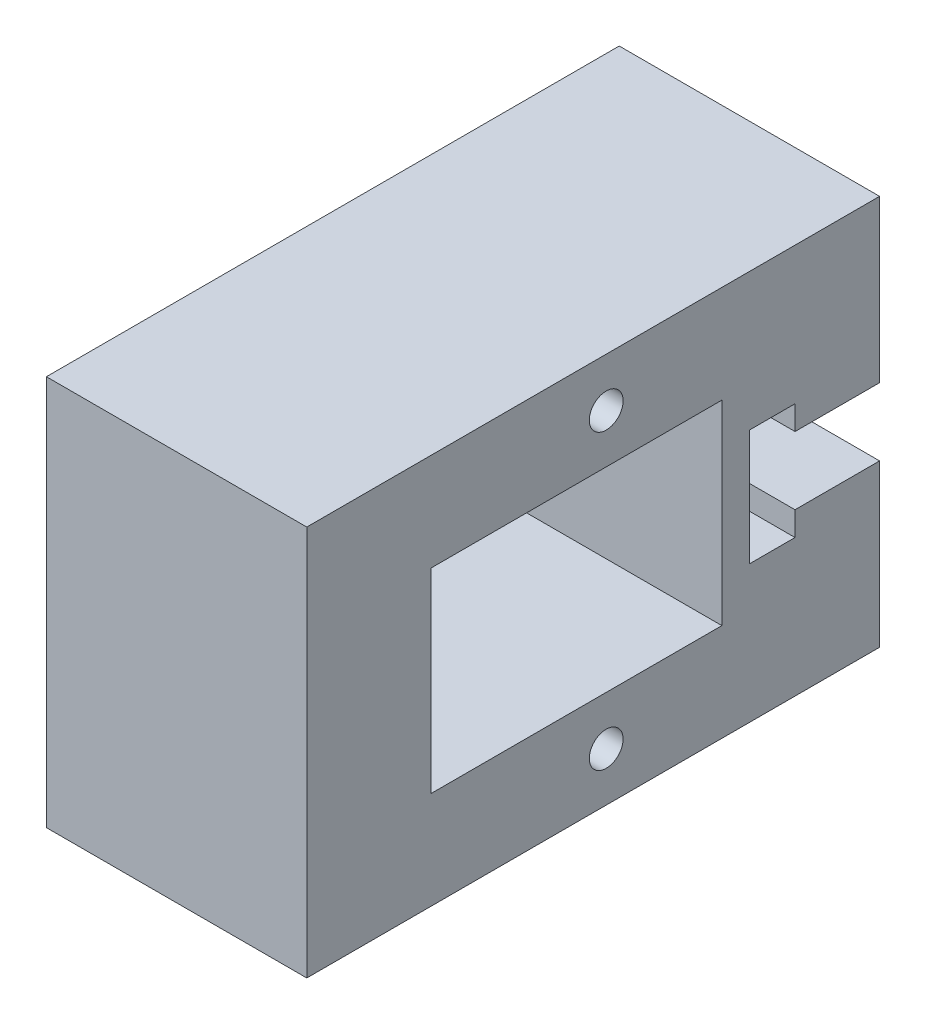
ISO-10303-21;
HEADER;
FILE_DESCRIPTION(('STEP AP214'),'2;1');
FILE_NAME('part.step','',(''),(''),'','','');
FILE_SCHEMA(('AUTOMOTIVE_DESIGN { 1 0 10303 214 1 1 1 1 }'));
ENDSEC;
DATA;
#1=APPLICATION_CONTEXT('core data for automotive mechanical design processes');
#2=APPLICATION_PROTOCOL_DEFINITION('international standard','automotive_design',2000,#1);
#3=PRODUCT_CONTEXT('',#1,'mechanical');
#4=PRODUCT('Part','Part','',(#3));
#5=PRODUCT_RELATED_PRODUCT_CATEGORY('part','',(#4));
#6=PRODUCT_DEFINITION_FORMATION('','',#4);
#7=PRODUCT_DEFINITION_CONTEXT('part definition',#1,'design');
#8=PRODUCT_DEFINITION('design','',#6,#7);
#9=PRODUCT_DEFINITION_SHAPE('','',#8);
#10=(LENGTH_UNIT() NAMED_UNIT(*) SI_UNIT(.MILLI.,.METRE.));
#11=(NAMED_UNIT(*) PLANE_ANGLE_UNIT() SI_UNIT($,.RADIAN.));
#12=(NAMED_UNIT(*) SI_UNIT($,.STERADIAN.) SOLID_ANGLE_UNIT());
#13=UNCERTAINTY_MEASURE_WITH_UNIT(LENGTH_MEASURE(1.E-05),#10,'distance_accuracy_value','');
#14=(GEOMETRIC_REPRESENTATION_CONTEXT(3) GLOBAL_UNCERTAINTY_ASSIGNED_CONTEXT((#13)) GLOBAL_UNIT_ASSIGNED_CONTEXT((#10,
#11,#12)) REPRESENTATION_CONTEXT('',''));
#15=CARTESIAN_POINT('',(0.,0.,0.));
#16=DIRECTION('',(0.,0.,1.));
#17=DIRECTION('',(1.,0.,0.));
#18=AXIS2_PLACEMENT_3D('',#15,#16,#17);
#19=CARTESIAN_POINT('',(3.81,3.175,43.7803718369585));
#20=DIRECTION('',(0.,0.,1.));
#21=DIRECTION('',(1.,0.,0.));
#22=AXIS2_PLACEMENT_3D('',#19,#20,#21);
#23=PLANE('',#22);
#24=DIRECTION('',(-1.,0.,0.));
#25=VECTOR('',#24,1.);
#26=CARTESIAN_POINT('',(25.4,28.575,43.7803718369585));
#27=LINE('',#26,#25);
#28=CARTESIAN_POINT('',(25.4,28.575,43.7803718369585));
#29=VERTEX_POINT('',#28);
#30=CARTESIAN_POINT('',(3.81,28.575,43.7803718369585));
#31=VERTEX_POINT('',#30);
#32=EDGE_CURVE('E199',#29,#31,#27,.T.);
#33=ORIENTED_EDGE('',*,*,#32,.F.);
#34=DIRECTION('',(0.,-1.,0.));
#35=VECTOR('',#34,1.);
#36=CARTESIAN_POINT('',(25.4,3.175,43.7803718369585));
#37=LINE('',#36,#35);
#38=CARTESIAN_POINT('',(25.4,9.525,43.7803718369585));
#39=VERTEX_POINT('',#38);
#40=EDGE_CURVE('E317',#29,#39,#37,.T.);
#41=ORIENTED_EDGE('',*,*,#40,.T.);
#42=DIRECTION('',(-1.,0.,0.));
#43=VECTOR('',#42,1.);
#44=CARTESIAN_POINT('',(25.4,9.525,43.7803718369585));
#45=LINE('',#44,#43);
#46=CARTESIAN_POINT('',(3.81,9.525,43.7803718369585));
#47=VERTEX_POINT('',#46);
#48=EDGE_CURVE('E353',#39,#47,#45,.T.);
#49=ORIENTED_EDGE('',*,*,#48,.T.);
#50=DIRECTION('',(0.,-1.,0.));
#51=VECTOR('',#50,1.);
#52=CARTESIAN_POINT('',(3.81,3.175,43.7803718369585));
#53=LINE('',#52,#51);
#54=EDGE_CURVE('E200',#31,#47,#53,.T.);
#55=ORIENTED_EDGE('',*,*,#54,.F.);
#56=EDGE_LOOP('',(#33,#41,#49,#55));
#57=FACE_BOUND('',#56,.T.);
#58=ADVANCED_FACE('F39',(#57),#23,.F.);
#59=CARTESIAN_POINT('',(3.81,3.175,15.3860528668309));
#60=DIRECTION('',(0.,0.,-1.));
#61=DIRECTION('',(-1.,0.,0.));
#62=AXIS2_PLACEMENT_3D('',#59,#60,#61);
#63=PLANE('',#62);
#64=DIRECTION('',(0.,1.,0.));
#65=VECTOR('',#64,1.);
#66=CARTESIAN_POINT('',(0.,8.255,15.3860528668309));
#67=LINE('',#66,#65);
#68=CARTESIAN_POINT('',(0.,9.525,15.3860528668309));
#69=VERTEX_POINT('',#68);
#70=CARTESIAN_POINT('',(0.,28.575,15.3860528668309));
#71=VERTEX_POINT('',#70);
#72=EDGE_CURVE('E350',#69,#71,#67,.T.);
#73=ORIENTED_EDGE('',*,*,#72,.F.);
#74=DIRECTION('',(-1.,0.,0.));
#75=VECTOR('',#74,1.);
#76=CARTESIAN_POINT('',(25.4,9.525,15.3860528668309));
#77=LINE('',#76,#75);
#78=CARTESIAN_POINT('',(25.4,9.525,15.3860528668309));
#79=VERTEX_POINT('',#78);
#80=EDGE_CURVE('E64',#79,#69,#77,.T.);
#81=ORIENTED_EDGE('',*,*,#80,.F.);
#82=DIRECTION('',(0.,1.,0.));
#83=VECTOR('',#82,1.);
#84=CARTESIAN_POINT('',(25.4,3.175,15.3860528668309));
#85=LINE('',#84,#83);
#86=CARTESIAN_POINT('',(25.4,28.575,15.3860528668309));
#87=VERTEX_POINT('',#86);
#88=EDGE_CURVE('E313',#79,#87,#85,.T.);
#89=ORIENTED_EDGE('',*,*,#88,.T.);
#90=DIRECTION('',(-1.,0.,0.));
#91=VECTOR('',#90,1.);
#92=CARTESIAN_POINT('',(25.4,28.575,15.3860528668309));
#93=LINE('',#92,#91);
#94=EDGE_CURVE('E53',#87,#71,#93,.T.);
#95=ORIENTED_EDGE('',*,*,#94,.T.);
#96=EDGE_LOOP('',(#73,#81,#89,#95));
#97=FACE_BOUND('',#96,.T.);
#98=ADVANCED_FACE('F375',(#97),#63,.F.);
#99=CARTESIAN_POINT('',(3.81,0.,0.));
#100=DIRECTION('',(1.,0.,0.));
#101=DIRECTION('',(0.,0.,-1.));
#102=AXIS2_PLACEMENT_3D('',#99,#100,#101);
#103=PLANE('',#102);
#104=CARTESIAN_POINT('',(3.81,20.0659999999997,37.8193000873051));
#105=DIRECTION('',(1.,0.,0.));
#106=DIRECTION('',(0.,0.,-1.));
#107=AXIS2_PLACEMENT_3D('',#104,#105,#106);
#108=CIRCLE('',#107,3.175);
#109=CARTESIAN_POINT('',(3.81,20.0659999999997,34.6443000873051));
#110=VERTEX_POINT('',#109);
#111=EDGE_CURVE('E311',#110,#110,#108,.F.);
#112=ORIENTED_EDGE('',*,*,#111,.T.);
#113=EDGE_LOOP('',(#112));
#114=FACE_BOUND('',#113,.T.);
#115=DIRECTION('',(0.,-1.,0.));
#116=VECTOR('',#115,1.);
#117=CARTESIAN_POINT('',(3.81,0.,28.5750000000002));
#118=LINE('',#117,#116);
#119=CARTESIAN_POINT('',(3.81,28.575,28.5750000000002));
#120=VERTEX_POINT('',#119);
#121=CARTESIAN_POINT('',(3.81,9.525,28.5750000000002));
#122=VERTEX_POINT('',#121);
#123=EDGE_CURVE('E185',#120,#122,#118,.T.);
#124=ORIENTED_EDGE('',*,*,#123,.F.);
#125=DIRECTION('',(0.,0.,1.));
#126=VECTOR('',#125,1.);
#127=CARTESIAN_POINT('',(3.81,28.575,0.));
#128=LINE('',#127,#126);
#129=EDGE_CURVE('E197',#120,#31,#128,.T.);
#130=ORIENTED_EDGE('',*,*,#129,.T.);
#131=ORIENTED_EDGE('',*,*,#54,.T.);
#132=DIRECTION('',(0.,0.,-1.));
#133=VECTOR('',#132,1.);
#134=CARTESIAN_POINT('',(3.81,9.525,0.));
#135=LINE('',#134,#133);
#136=EDGE_CURVE('E195',#47,#122,#135,.T.);
#137=ORIENTED_EDGE('',*,*,#136,.T.);
#138=EDGE_LOOP('',(#124,#130,#131,#137));
#139=FACE_BOUND('',#138,.T.);
#140=ADVANCED_FACE('F191',(#114,#139),#103,.T.);
#141=CARTESIAN_POINT('',(25.4,19.05,28.5750000000002));
#142=DIRECTION('',(0.,0.,1.));
#143=DIRECTION('',(1.,0.,0.));
#144=AXIS2_PLACEMENT_3D('',#141,#142,#143);
#145=PLANE('',#144);
#146=DIRECTION('',(-1.,0.,0.));
#147=VECTOR('',#146,1.);
#148=CARTESIAN_POINT('',(25.4,28.575,28.5750000000002));
#149=LINE('',#148,#147);
#150=CARTESIAN_POINT('',(0.,28.575,28.5750000000002));
#151=VERTEX_POINT('',#150);
#152=EDGE_CURVE('E11',#120,#151,#149,.T.);
#153=ORIENTED_EDGE('',*,*,#152,.F.);
#154=ORIENTED_EDGE('',*,*,#123,.T.);
#155=DIRECTION('',(1.,0.,0.));
#156=VECTOR('',#155,1.);
#157=CARTESIAN_POINT('',(25.4,9.525,28.5750000000002));
#158=LINE('',#157,#156);
#159=CARTESIAN_POINT('',(0.,9.525,28.5750000000002));
#160=VERTEX_POINT('',#159);
#161=EDGE_CURVE('E50',#160,#122,#158,.T.);
#162=ORIENTED_EDGE('',*,*,#161,.F.);
#163=DIRECTION('',(0.,1.,0.));
#164=VECTOR('',#163,1.);
#165=CARTESIAN_POINT('',(0.,19.05,28.5750000000002));
#166=LINE('',#165,#164);
#167=EDGE_CURVE('E275',#160,#151,#166,.T.);
#168=ORIENTED_EDGE('',*,*,#167,.T.);
#169=EDGE_LOOP('',(#153,#154,#162,#168));
#170=FACE_BOUND('',#169,.T.);
#171=ADVANCED_FACE('F183',(#170),#145,.F.);
#172=CARTESIAN_POINT('',(0.,0.,0.));
#173=DIRECTION('',(-1.,0.,0.));
#174=DIRECTION('',(0.,0.,1.));
#175=AXIS2_PLACEMENT_3D('',#172,#173,#174);
#176=PLANE('',#175);
#177=DIRECTION('',(0.,0.,1.));
#178=VECTOR('',#177,1.);
#179=CARTESIAN_POINT('',(0.,9.525,43.7803718369585));
#180=LINE('',#179,#178);
#181=EDGE_CURVE('E202',#69,#160,#180,.T.);
#182=ORIENTED_EDGE('',*,*,#181,.F.);
#183=ORIENTED_EDGE('',*,*,#72,.T.);
#184=DIRECTION('',(0.,0.,-1.));
#185=VECTOR('',#184,1.);
#186=CARTESIAN_POINT('',(0.,28.575,43.7803718369585));
#187=LINE('',#186,#185);
#188=EDGE_CURVE('E352',#151,#71,#187,.T.);
#189=ORIENTED_EDGE('',*,*,#188,.F.);
#190=ORIENTED_EDGE('',*,*,#167,.F.);
#191=EDGE_LOOP('',(#182,#183,#189,#190));
#192=FACE_BOUND('',#191,.T.);
#193=CARTESIAN_POINT('',(0.,33.3375,26.67));
#194=DIRECTION('',(1.,0.,0.));
#195=DIRECTION('',(0.,0.,-1.));
#196=AXIS2_PLACEMENT_3D('',#193,#194,#195);
#197=CIRCLE('',#196,1.651);
#198=CARTESIAN_POINT('',(0.,33.3375,25.019));
#199=VERTEX_POINT('',#198);
#200=EDGE_CURVE('E333',#199,#199,#197,.T.);
#201=ORIENTED_EDGE('',*,*,#200,.T.);
#202=EDGE_LOOP('',(#201));
#203=FACE_BOUND('',#202,.T.);
#204=CARTESIAN_POINT('',(0.,20.0659999999997,37.8193000873051));
#205=DIRECTION('',(-1.,0.,0.));
#206=DIRECTION('',(0.,0.,1.));
#207=AXIS2_PLACEMENT_3D('',#204,#205,#206);
#208=CIRCLE('',#207,3.175);
#209=CARTESIAN_POINT('',(0.,20.0659999999997,40.9943000873051));
#210=VERTEX_POINT('',#209);
#211=EDGE_CURVE('E291',#210,#210,#208,.T.);
#212=ORIENTED_EDGE('',*,*,#211,.F.);
#213=EDGE_LOOP('',(#212));
#214=FACE_BOUND('',#213,.T.);
#215=DIRECTION('',(0.,1.,0.));
#216=VECTOR('',#215,1.);
#217=CARTESIAN_POINT('',(0.,13.3985,8.25008478814695));
#218=LINE('',#217,#216);
#219=CARTESIAN_POINT('',(0.,13.3985,8.25008478814695));
#220=VERTEX_POINT('',#219);
#221=CARTESIAN_POINT('',(0.,15.748,8.25008478814695));
#222=VERTEX_POINT('',#221);
#223=EDGE_CURVE('E289',#220,#222,#218,.T.);
#224=ORIENTED_EDGE('',*,*,#223,.T.);
#225=DIRECTION('',(0.,0.,-1.));
#226=VECTOR('',#225,1.);
#227=CARTESIAN_POINT('',(0.,15.748,8.25008478814695));
#228=LINE('',#227,#226);
#229=CARTESIAN_POINT('',(0.,15.748,0.));
#230=VERTEX_POINT('',#229);
#231=EDGE_CURVE('E282',#222,#230,#228,.T.);
#232=ORIENTED_EDGE('',*,*,#231,.T.);
#233=DIRECTION('',(0.,1.,0.));
#234=VECTOR('',#233,1.);
#235=CARTESIAN_POINT('',(0.,0.,0.));
#236=LINE('',#235,#234);
#237=CARTESIAN_POINT('',(0.,0.,0.));
#238=VERTEX_POINT('',#237);
#239=EDGE_CURVE('E217',#238,#230,#236,.T.);
#240=ORIENTED_EDGE('',*,*,#239,.F.);
#241=DIRECTION('',(0.,0.,-1.));
#242=VECTOR('',#241,1.);
#243=CARTESIAN_POINT('',(0.,0.,0.));
#244=LINE('',#243,#242);
#245=CARTESIAN_POINT('',(0.,0.,55.88));
#246=VERTEX_POINT('',#245);
#247=EDGE_CURVE('E225',#246,#238,#244,.T.);
#248=ORIENTED_EDGE('',*,*,#247,.F.);
#249=DIRECTION('',(0.,-1.,0.));
#250=VECTOR('',#249,1.);
#251=CARTESIAN_POINT('',(0.,38.1,55.88));
#252=LINE('',#251,#250);
#253=CARTESIAN_POINT('',(0.,38.1,55.88));
#254=VERTEX_POINT('',#253);
#255=EDGE_CURVE('E305',#254,#246,#252,.T.);
#256=ORIENTED_EDGE('',*,*,#255,.F.);
#257=DIRECTION('',(0.,0.,1.));
#258=VECTOR('',#257,1.);
#259=CARTESIAN_POINT('',(0.,38.1,0.));
#260=LINE('',#259,#258);
#261=CARTESIAN_POINT('',(0.,38.1,0.));
#262=VERTEX_POINT('',#261);
#263=EDGE_CURVE('E216',#262,#254,#260,.T.);
#264=ORIENTED_EDGE('',*,*,#263,.F.);
#265=CARTESIAN_POINT('',(0.,22.352,0.));
#266=VERTEX_POINT('',#265);
#267=EDGE_CURVE('E224',#266,#262,#236,.T.);
#268=ORIENTED_EDGE('',*,*,#267,.F.);
#269=DIRECTION('',(0.,0.,1.));
#270=VECTOR('',#269,1.);
#271=CARTESIAN_POINT('',(0.,22.352,8.25008478814695));
#272=LINE('',#271,#270);
#273=CARTESIAN_POINT('',(0.,22.352,8.25008478814695));
#274=VERTEX_POINT('',#273);
#275=EDGE_CURVE('E281',#266,#274,#272,.T.);
#276=ORIENTED_EDGE('',*,*,#275,.T.);
#277=DIRECTION('',(0.,1.,0.));
#278=VECTOR('',#277,1.);
#279=CARTESIAN_POINT('',(0.,22.352,8.25008478814695));
#280=LINE('',#279,#278);
#281=CARTESIAN_POINT('',(0.,24.7015,8.25008478814695));
#282=VERTEX_POINT('',#281);
#283=EDGE_CURVE('E277',#274,#282,#280,.T.);
#284=ORIENTED_EDGE('',*,*,#283,.T.);
#285=DIRECTION('',(0.,0.,1.));
#286=VECTOR('',#285,1.);
#287=CARTESIAN_POINT('',(0.,24.7015,12.7000000000002));
#288=LINE('',#287,#286);
#289=CARTESIAN_POINT('',(0.,24.7015,12.7000000000002));
#290=VERTEX_POINT('',#289);
#291=EDGE_CURVE('E273',#282,#290,#288,.T.);
#292=ORIENTED_EDGE('',*,*,#291,.T.);
#293=DIRECTION('',(0.,-1.,0.));
#294=VECTOR('',#293,1.);
#295=CARTESIAN_POINT('',(0.,13.3985,12.7));
#296=LINE('',#295,#294);
#297=CARTESIAN_POINT('',(0.,13.3985,12.7));
#298=VERTEX_POINT('',#297);
#299=EDGE_CURVE('E240',#290,#298,#296,.T.);
#300=ORIENTED_EDGE('',*,*,#299,.T.);
#301=DIRECTION('',(0.,0.,-1.));
#302=VECTOR('',#301,1.);
#303=CARTESIAN_POINT('',(0.,13.3985,12.7));
#304=LINE('',#303,#302);
#305=EDGE_CURVE('E251',#298,#220,#304,.T.);
#306=ORIENTED_EDGE('',*,*,#305,.T.);
#307=EDGE_LOOP('',(#224,#232,#240,#248,#256,#264,#268,#276,#284,#292,#300,#306));
#308=FACE_BOUND('',#307,.T.);
#309=CARTESIAN_POINT('',(0.,4.76250000000001,26.67));
#310=DIRECTION('',(1.,0.,0.));
#311=DIRECTION('',(0.,0.,-1.));
#312=AXIS2_PLACEMENT_3D('',#309,#310,#311);
#313=CIRCLE('',#312,1.651);
#314=CARTESIAN_POINT('',(0.,4.76250000000001,25.019));
#315=VERTEX_POINT('',#314);
#316=EDGE_CURVE('E329',#315,#315,#313,.T.);
#317=ORIENTED_EDGE('',*,*,#316,.T.);
#318=EDGE_LOOP('',(#317));
#319=FACE_BOUND('',#318,.T.);
#320=ADVANCED_FACE('F369',(#192,#203,#214,#308,#319),#176,.T.);
#321=CARTESIAN_POINT('',(25.4,0.,0.));
#322=DIRECTION('',(-1.,0.,0.));
#323=DIRECTION('',(0.,0.,1.));
#324=AXIS2_PLACEMENT_3D('',#321,#322,#323);
#325=PLANE('',#324);
#326=ORIENTED_EDGE('',*,*,#40,.F.);
#327=DIRECTION('',(0.,0.,-1.));
#328=VECTOR('',#327,1.);
#329=CARTESIAN_POINT('',(25.4,28.575,43.7803718369585));
#330=LINE('',#329,#328);
#331=EDGE_CURVE('E363',#29,#87,#330,.T.);
#332=ORIENTED_EDGE('',*,*,#331,.T.);
#333=ORIENTED_EDGE('',*,*,#88,.F.);
#334=DIRECTION('',(0.,0.,1.));
#335=VECTOR('',#334,1.);
#336=CARTESIAN_POINT('',(25.4,9.525,43.7803718369585));
#337=LINE('',#336,#335);
#338=EDGE_CURVE('E354',#79,#39,#337,.T.);
#339=ORIENTED_EDGE('',*,*,#338,.T.);
#340=EDGE_LOOP('',(#326,#332,#333,#339));
#341=FACE_BOUND('',#340,.T.);
#342=CARTESIAN_POINT('',(25.4,4.76250000000001,26.67));
#343=DIRECTION('',(1.,0.,0.));
#344=DIRECTION('',(0.,0.,-1.));
#345=AXIS2_PLACEMENT_3D('',#342,#343,#344);
#346=CIRCLE('',#345,1.651);
#347=CARTESIAN_POINT('',(25.4,4.76250000000001,25.019));
#348=VERTEX_POINT('',#347);
#349=EDGE_CURVE('E336',#348,#348,#346,.T.);
#350=ORIENTED_EDGE('',*,*,#349,.F.);
#351=EDGE_LOOP('',(#350));
#352=FACE_BOUND('',#351,.T.);
#353=CARTESIAN_POINT('',(25.4,33.3375,26.67));
#354=DIRECTION('',(1.,0.,0.));
#355=DIRECTION('',(0.,0.,-1.));
#356=AXIS2_PLACEMENT_3D('',#353,#354,#355);
#357=CIRCLE('',#356,1.651);
#358=CARTESIAN_POINT('',(25.4,33.3375,25.019));
#359=VERTEX_POINT('',#358);
#360=EDGE_CURVE('E332',#359,#359,#357,.T.);
#361=ORIENTED_EDGE('',*,*,#360,.F.);
#362=EDGE_LOOP('',(#361));
#363=FACE_BOUND('',#362,.T.);
#364=DIRECTION('',(0.,0.,-1.));
#365=VECTOR('',#364,1.);
#366=CARTESIAN_POINT('',(25.4,15.748,8.25008478814695));
#367=LINE('',#366,#365);
#368=CARTESIAN_POINT('',(25.4,15.748,8.25008478814695));
#369=VERTEX_POINT('',#368);
#370=CARTESIAN_POINT('',(25.4,15.748,0.));
#371=VERTEX_POINT('',#370);
#372=EDGE_CURVE('E262',#369,#371,#367,.T.);
#373=ORIENTED_EDGE('',*,*,#372,.F.);
#374=DIRECTION('',(0.,1.,0.));
#375=VECTOR('',#374,1.);
#376=CARTESIAN_POINT('',(25.4,13.3985,8.25008478814695));
#377=LINE('',#376,#375);
#378=CARTESIAN_POINT('',(25.4,13.3985,8.25008478814695));
#379=VERTEX_POINT('',#378);
#380=EDGE_CURVE('E268',#379,#369,#377,.T.);
#381=ORIENTED_EDGE('',*,*,#380,.F.);
#382=DIRECTION('',(0.,0.,-1.));
#383=VECTOR('',#382,1.);
#384=CARTESIAN_POINT('',(25.4,13.3985,12.7));
#385=LINE('',#384,#383);
#386=CARTESIAN_POINT('',(25.4,13.3985,12.7));
#387=VERTEX_POINT('',#386);
#388=EDGE_CURVE('E267',#387,#379,#385,.T.);
#389=ORIENTED_EDGE('',*,*,#388,.F.);
#390=DIRECTION('',(0.,-1.,0.));
#391=VECTOR('',#390,1.);
#392=CARTESIAN_POINT('',(25.4,13.3985,12.7));
#393=LINE('',#392,#391);
#394=CARTESIAN_POINT('',(25.4,24.7015,12.7000000000002));
#395=VERTEX_POINT('',#394);
#396=EDGE_CURVE('E252',#395,#387,#393,.T.);
#397=ORIENTED_EDGE('',*,*,#396,.F.);
#398=DIRECTION('',(0.,0.,1.));
#399=VECTOR('',#398,1.);
#400=CARTESIAN_POINT('',(25.4,24.7015,12.7000000000002));
#401=LINE('',#400,#399);
#402=CARTESIAN_POINT('',(25.4,24.7015,8.25008478814695));
#403=VERTEX_POINT('',#402);
#404=EDGE_CURVE('E253',#403,#395,#401,.T.);
#405=ORIENTED_EDGE('',*,*,#404,.F.);
#406=DIRECTION('',(0.,1.,0.));
#407=VECTOR('',#406,1.);
#408=CARTESIAN_POINT('',(25.4,22.352,8.25008478814695));
#409=LINE('',#408,#407);
#410=CARTESIAN_POINT('',(25.4,22.352,8.25008478814695));
#411=VERTEX_POINT('',#410);
#412=EDGE_CURVE('E257',#411,#403,#409,.T.);
#413=ORIENTED_EDGE('',*,*,#412,.F.);
#414=DIRECTION('',(0.,0.,1.));
#415=VECTOR('',#414,1.);
#416=CARTESIAN_POINT('',(25.4,22.352,8.25008478814695));
#417=LINE('',#416,#415);
#418=CARTESIAN_POINT('',(25.4,22.352,0.));
#419=VERTEX_POINT('',#418);
#420=EDGE_CURVE('E261',#419,#411,#417,.T.);
#421=ORIENTED_EDGE('',*,*,#420,.F.);
#422=DIRECTION('',(0.,1.,0.));
#423=VECTOR('',#422,1.);
#424=CARTESIAN_POINT('',(25.4,0.,0.));
#425=LINE('',#424,#423);
#426=CARTESIAN_POINT('',(25.4,38.1,0.));
#427=VERTEX_POINT('',#426);
#428=EDGE_CURVE('E233',#419,#427,#425,.T.);
#429=ORIENTED_EDGE('',*,*,#428,.T.);
#430=DIRECTION('',(0.,0.,1.));
#431=VECTOR('',#430,1.);
#432=CARTESIAN_POINT('',(25.4,38.1,0.));
#433=LINE('',#432,#431);
#434=CARTESIAN_POINT('',(25.4,38.1,55.88));
#435=VERTEX_POINT('',#434);
#436=EDGE_CURVE('E211',#427,#435,#433,.T.);
#437=ORIENTED_EDGE('',*,*,#436,.T.);
#438=DIRECTION('',(0.,1.,0.));
#439=VECTOR('',#438,1.);
#440=CARTESIAN_POINT('',(25.4,0.,55.88));
#441=LINE('',#440,#439);
#442=CARTESIAN_POINT('',(25.4,0.,55.88));
#443=VERTEX_POINT('',#442);
#444=EDGE_CURVE('E298',#443,#435,#441,.T.);
#445=ORIENTED_EDGE('',*,*,#444,.F.);
#446=DIRECTION('',(0.,0.,-1.));
#447=VECTOR('',#446,1.);
#448=CARTESIAN_POINT('',(25.4,0.,0.));
#449=LINE('',#448,#447);
#450=CARTESIAN_POINT('',(25.4,0.,0.));
#451=VERTEX_POINT('',#450);
#452=EDGE_CURVE('E218',#443,#451,#449,.T.);
#453=ORIENTED_EDGE('',*,*,#452,.T.);
#454=EDGE_CURVE('E226',#451,#371,#425,.T.);
#455=ORIENTED_EDGE('',*,*,#454,.T.);
#456=EDGE_LOOP('',(#373,#381,#389,#397,#405,#413,#421,#429,#437,#445,#453,#455));
#457=FACE_BOUND('',#456,.T.);
#458=ADVANCED_FACE('F376',(#341,#352,#363,#457),#325,.F.);
#459=CARTESIAN_POINT('',(25.4,20.0659999999997,37.8193000873051));
#460=DIRECTION('',(-1.,0.,0.));
#461=DIRECTION('',(0.,0.,1.));
#462=AXIS2_PLACEMENT_3D('',#459,#460,#461);
#463=CYLINDRICAL_SURFACE('',#462,3.175);
#464=ORIENTED_EDGE('',*,*,#211,.T.);
#465=EDGE_LOOP('',(#464));
#466=FACE_BOUND('',#465,.T.);
#467=ORIENTED_EDGE('',*,*,#111,.F.);
#468=EDGE_LOOP('',(#467));
#469=FACE_BOUND('',#468,.T.);
#470=ADVANCED_FACE('F399',(#466,#469),#463,.F.);
#471=CARTESIAN_POINT('',(25.4,5.33399999999972,24.0542333042316));
#472=DIRECTION('',(-1.,0.,0.));
#473=DIRECTION('',(0.,0.,1.));
#474=AXIS2_PLACEMENT_3D('',#471,#472,#473);
#475=CYLINDRICAL_SURFACE('',#474,3.175);
#476=DIRECTION('',(-1.,0.,0.));
#477=VECTOR('',#476,1.);
#478=CARTESIAN_POINT('',(25.4,3.175,21.7262848511938));
#479=LINE('',#478,#477);
#480=CARTESIAN_POINT('',(20.4,3.175,21.7262848511938));
#481=VERTEX_POINT('',#480);
#482=CARTESIAN_POINT('',(3.81,3.175,21.7262848511938));
#483=VERTEX_POINT('',#482);
#484=EDGE_CURVE('E308',#481,#483,#479,.T.);
#485=ORIENTED_EDGE('',*,*,#484,.T.);
#486=CARTESIAN_POINT('',(3.81,5.33399999999972,24.0542333042316));
#487=DIRECTION('',(-1.,0.,0.));
#488=DIRECTION('',(0.,0.,1.));
#489=AXIS2_PLACEMENT_3D('',#486,#487,#488);
#490=CIRCLE('',#489,3.175);
#491=CARTESIAN_POINT('',(3.81,3.14249204174896,26.3516052525507));
#492=VERTEX_POINT('',#491);
#493=EDGE_CURVE('E345',#483,#492,#490,.T.);
#494=ORIENTED_EDGE('',*,*,#493,.T.);
#495=DIRECTION('',(1.,0.,0.));
#496=VECTOR('',#495,1.);
#497=CARTESIAN_POINT('',(12.7,3.14249204174896,26.3516052525507));
#498=LINE('',#497,#496);
#499=CARTESIAN_POINT('',(20.4,3.14249204174896,26.3516052525507));
#500=VERTEX_POINT('',#499);
#501=EDGE_CURVE('E324',#492,#500,#498,.T.);
#502=ORIENTED_EDGE('',*,*,#501,.T.);
#503=CARTESIAN_POINT('',(20.4,5.33399999999972,24.0542333042316));
#504=DIRECTION('',(1.,0.,0.));
#505=DIRECTION('',(0.,0.,-1.));
#506=AXIS2_PLACEMENT_3D('',#503,#504,#505);
#507=CIRCLE('',#506,3.175);
#508=EDGE_CURVE('E186',#481,#500,#507,.F.);
#509=ORIENTED_EDGE('',*,*,#508,.F.);
#510=EDGE_LOOP('',(#485,#494,#502,#509));
#511=FACE_BOUND('',#510,.T.);
#512=ADVANCED_FACE('F401',(#511),#475,.F.);
#513=CARTESIAN_POINT('',(25.4,0.,0.));
#514=DIRECTION('',(0.,0.,1.));
#515=DIRECTION('',(1.,0.,0.));
#516=AXIS2_PLACEMENT_3D('',#513,#514,#515);
#517=PLANE('',#516);
#518=DIRECTION('',(1.,0.,0.));
#519=VECTOR('',#518,1.);
#520=CARTESIAN_POINT('',(0.,22.352,0.));
#521=LINE('',#520,#519);
#522=EDGE_CURVE('E245',#266,#419,#521,.T.);
#523=ORIENTED_EDGE('',*,*,#522,.F.);
#524=ORIENTED_EDGE('',*,*,#267,.T.);
#525=DIRECTION('',(-1.,0.,0.));
#526=VECTOR('',#525,1.);
#527=CARTESIAN_POINT('',(25.4,38.1,0.));
#528=LINE('',#527,#526);
#529=EDGE_CURVE('E214',#427,#262,#528,.T.);
#530=ORIENTED_EDGE('',*,*,#529,.F.);
#531=ORIENTED_EDGE('',*,*,#428,.F.);
#532=EDGE_LOOP('',(#523,#524,#530,#531));
#533=FACE_BOUND('',#532,.T.);
#534=ADVANCED_FACE('F409',(#533),#517,.F.);
#535=CARTESIAN_POINT('',(25.4,0.,0.));
#536=DIRECTION('',(0.,1.,0.));
#537=DIRECTION('',(0.,0.,1.));
#538=AXIS2_PLACEMENT_3D('',#535,#536,#537);
#539=PLANE('',#538);
#540=ORIENTED_EDGE('',*,*,#247,.T.);
#541=DIRECTION('',(-1.,0.,0.));
#542=VECTOR('',#541,1.);
#543=CARTESIAN_POINT('',(25.4,0.,0.));
#544=LINE('',#543,#542);
#545=EDGE_CURVE('E188',#451,#238,#544,.T.);
#546=ORIENTED_EDGE('',*,*,#545,.F.);
#547=ORIENTED_EDGE('',*,*,#452,.F.);
#548=DIRECTION('',(1.,0.,0.));
#549=VECTOR('',#548,1.);
#550=CARTESIAN_POINT('',(0.,0.,55.88));
#551=LINE('',#550,#549);
#552=EDGE_CURVE('E299',#246,#443,#551,.T.);
#553=ORIENTED_EDGE('',*,*,#552,.F.);
#554=EDGE_LOOP('',(#540,#546,#547,#553));
#555=FACE_BOUND('',#554,.T.);
#556=ADVANCED_FACE('F41',(#555),#539,.F.);
#557=ORIENTED_EDGE('',*,*,#239,.T.);
#558=DIRECTION('',(1.,0.,0.));
#559=VECTOR('',#558,1.);
#560=CARTESIAN_POINT('',(0.,15.748,0.));
#561=LINE('',#560,#559);
#562=EDGE_CURVE('E237',#230,#371,#561,.T.);
#563=ORIENTED_EDGE('',*,*,#562,.T.);
#564=ORIENTED_EDGE('',*,*,#454,.F.);
#565=ORIENTED_EDGE('',*,*,#545,.T.);
#566=EDGE_LOOP('',(#557,#563,#564,#565));
#567=FACE_BOUND('',#566,.T.);
#568=ADVANCED_FACE('F447',(#567),#517,.F.);
#569=CARTESIAN_POINT('',(25.4,38.1,0.));
#570=DIRECTION('',(0.,-1.,0.));
#571=DIRECTION('',(0.,0.,-1.));
#572=AXIS2_PLACEMENT_3D('',#569,#570,#571);
#573=PLANE('',#572);
#574=ORIENTED_EDGE('',*,*,#263,.T.);
#575=DIRECTION('',(-1.,0.,0.));
#576=VECTOR('',#575,1.);
#577=CARTESIAN_POINT('',(25.4,38.1,55.88));
#578=LINE('',#577,#576);
#579=EDGE_CURVE('E304',#435,#254,#578,.T.);
#580=ORIENTED_EDGE('',*,*,#579,.F.);
#581=ORIENTED_EDGE('',*,*,#436,.F.);
#582=ORIENTED_EDGE('',*,*,#529,.T.);
#583=EDGE_LOOP('',(#574,#580,#581,#582));
#584=FACE_BOUND('',#583,.T.);
#585=ADVANCED_FACE('F437',(#584),#573,.F.);
#586=CARTESIAN_POINT('',(0.,13.3985,12.7));
#587=DIRECTION('',(0.,-1.,0.));
#588=DIRECTION('',(0.,0.,-1.));
#589=AXIS2_PLACEMENT_3D('',#586,#587,#588);
#590=PLANE('',#589);
#591=ORIENTED_EDGE('',*,*,#388,.T.);
#592=DIRECTION('',(1.,0.,0.));
#593=VECTOR('',#592,1.);
#594=CARTESIAN_POINT('',(0.,13.3985,8.25008478814695));
#595=LINE('',#594,#593);
#596=EDGE_CURVE('E234',#220,#379,#595,.T.);
#597=ORIENTED_EDGE('',*,*,#596,.F.);
#598=ORIENTED_EDGE('',*,*,#305,.F.);
#599=DIRECTION('',(1.,0.,0.));
#600=VECTOR('',#599,1.);
#601=CARTESIAN_POINT('',(0.,13.3985,12.7));
#602=LINE('',#601,#600);
#603=EDGE_CURVE('E228',#298,#387,#602,.T.);
#604=ORIENTED_EDGE('',*,*,#603,.T.);
#605=EDGE_LOOP('',(#591,#597,#598,#604));
#606=FACE_BOUND('',#605,.T.);
#607=ADVANCED_FACE('F419',(#606),#590,.F.);
#608=CARTESIAN_POINT('',(0.,13.3985,12.7));
#609=DIRECTION('',(0.,0.,1.));
#610=DIRECTION('',(0.,-1.,0.));
#611=AXIS2_PLACEMENT_3D('',#608,#609,#610);
#612=PLANE('',#611);
#613=ORIENTED_EDGE('',*,*,#396,.T.);
#614=ORIENTED_EDGE('',*,*,#603,.F.);
#615=ORIENTED_EDGE('',*,*,#299,.F.);
#616=DIRECTION('',(1.,0.,0.));
#617=VECTOR('',#616,1.);
#618=CARTESIAN_POINT('',(0.,24.7015,12.7000000000002));
#619=LINE('',#618,#617);
#620=EDGE_CURVE('E247',#290,#395,#619,.T.);
#621=ORIENTED_EDGE('',*,*,#620,.T.);
#622=EDGE_LOOP('',(#613,#614,#615,#621));
#623=FACE_BOUND('',#622,.T.);
#624=ADVANCED_FACE('F413',(#623),#612,.F.);
#625=CARTESIAN_POINT('',(0.,24.7015,12.7000000000002));
#626=DIRECTION('',(0.,1.,0.));
#627=DIRECTION('',(0.,0.,1.));
#628=AXIS2_PLACEMENT_3D('',#625,#626,#627);
#629=PLANE('',#628);
#630=ORIENTED_EDGE('',*,*,#404,.T.);
#631=ORIENTED_EDGE('',*,*,#620,.F.);
#632=ORIENTED_EDGE('',*,*,#291,.F.);
#633=DIRECTION('',(1.,0.,0.));
#634=VECTOR('',#633,1.);
#635=CARTESIAN_POINT('',(0.,24.7015,8.25008478814695));
#636=LINE('',#635,#634);
#637=EDGE_CURVE('E246',#282,#403,#636,.T.);
#638=ORIENTED_EDGE('',*,*,#637,.T.);
#639=EDGE_LOOP('',(#630,#631,#632,#638));
#640=FACE_BOUND('',#639,.T.);
#641=ADVANCED_FACE('F417',(#640),#629,.F.);
#642=CARTESIAN_POINT('',(0.,22.352,8.25008478814695));
#643=DIRECTION('',(0.,0.,-1.));
#644=DIRECTION('',(-1.,0.,0.));
#645=AXIS2_PLACEMENT_3D('',#642,#643,#644);
#646=PLANE('',#645);
#647=ORIENTED_EDGE('',*,*,#412,.T.);
#648=ORIENTED_EDGE('',*,*,#637,.F.);
#649=ORIENTED_EDGE('',*,*,#283,.F.);
#650=DIRECTION('',(1.,0.,0.));
#651=VECTOR('',#650,1.);
#652=CARTESIAN_POINT('',(0.,22.352,8.25008478814695));
#653=LINE('',#652,#651);
#654=EDGE_CURVE('E242',#274,#411,#653,.T.);
#655=ORIENTED_EDGE('',*,*,#654,.T.);
#656=EDGE_LOOP('',(#647,#648,#649,#655));
#657=FACE_BOUND('',#656,.T.);
#658=ADVANCED_FACE('F423',(#657),#646,.F.);
#659=CARTESIAN_POINT('',(0.,22.352,8.25008478814695));
#660=DIRECTION('',(0.,1.,0.));
#661=DIRECTION('',(0.,0.,1.));
#662=AXIS2_PLACEMENT_3D('',#659,#660,#661);
#663=PLANE('',#662);
#664=ORIENTED_EDGE('',*,*,#420,.T.);
#665=ORIENTED_EDGE('',*,*,#654,.F.);
#666=ORIENTED_EDGE('',*,*,#275,.F.);
#667=ORIENTED_EDGE('',*,*,#522,.T.);
#668=EDGE_LOOP('',(#664,#665,#666,#667));
#669=FACE_BOUND('',#668,.T.);
#670=ADVANCED_FACE('F424',(#669),#663,.F.);
#671=CARTESIAN_POINT('',(0.,15.748,8.25008478814695));
#672=DIRECTION('',(0.,-1.,0.));
#673=DIRECTION('',(0.,0.,-1.));
#674=AXIS2_PLACEMENT_3D('',#671,#672,#673);
#675=PLANE('',#674);
#676=ORIENTED_EDGE('',*,*,#372,.T.);
#677=ORIENTED_EDGE('',*,*,#562,.F.);
#678=ORIENTED_EDGE('',*,*,#231,.F.);
#679=DIRECTION('',(1.,0.,0.));
#680=VECTOR('',#679,1.);
#681=CARTESIAN_POINT('',(0.,15.748,8.25008478814695));
#682=LINE('',#681,#680);
#683=EDGE_CURVE('E236',#222,#369,#682,.T.);
#684=ORIENTED_EDGE('',*,*,#683,.T.);
#685=EDGE_LOOP('',(#676,#677,#678,#684));
#686=FACE_BOUND('',#685,.T.);
#687=ADVANCED_FACE('F429',(#686),#675,.F.);
#688=CARTESIAN_POINT('',(0.,13.3985,8.25008478814695));
#689=DIRECTION('',(0.,0.,-1.));
#690=DIRECTION('',(-1.,0.,0.));
#691=AXIS2_PLACEMENT_3D('',#688,#689,#690);
#692=PLANE('',#691);
#693=ORIENTED_EDGE('',*,*,#380,.T.);
#694=ORIENTED_EDGE('',*,*,#683,.F.);
#695=ORIENTED_EDGE('',*,*,#223,.F.);
#696=ORIENTED_EDGE('',*,*,#596,.T.);
#697=EDGE_LOOP('',(#693,#694,#695,#696));
#698=FACE_BOUND('',#697,.T.);
#699=ADVANCED_FACE('F396',(#698),#692,.F.);
#700=CARTESIAN_POINT('',(20.4,5.33399999999972,24.0542333042316));
#701=DIRECTION('',(1.,0.,0.));
#702=DIRECTION('',(0.,0.,-1.));
#703=AXIS2_PLACEMENT_3D('',#700,#701,#702);
#704=PLANE('',#703);
#705=ORIENTED_EDGE('',*,*,#508,.T.);
#706=CARTESIAN_POINT('',(20.4,4.76250000000001,26.67));
#707=DIRECTION('',(1.,0.,0.));
#708=DIRECTION('',(0.,0.,-1.));
#709=AXIS2_PLACEMENT_3D('',#706,#707,#708);
#710=CIRCLE('',#709,1.651);
#711=CARTESIAN_POINT('',(20.4,3.175,26.2165192947875));
#712=VERTEX_POINT('',#711);
#713=EDGE_CURVE('E325',#500,#712,#710,.T.);
#714=ORIENTED_EDGE('',*,*,#713,.T.);
#715=DIRECTION('',(0.,0.,-1.));
#716=VECTOR('',#715,1.);
#717=CARTESIAN_POINT('',(20.4,3.175,24.0542333042316));
#718=LINE('',#717,#716);
#719=EDGE_CURVE('E204',#712,#481,#718,.T.);
#720=ORIENTED_EDGE('',*,*,#719,.T.);
#721=EDGE_LOOP('',(#705,#714,#720));
#722=FACE_BOUND('',#721,.T.);
#723=ADVANCED_FACE('F392',(#722),#704,.F.);
#724=CARTESIAN_POINT('',(0.,0.,55.88));
#725=DIRECTION('',(0.,0.,1.));
#726=DIRECTION('',(1.,0.,0.));
#727=AXIS2_PLACEMENT_3D('',#724,#725,#726);
#728=PLANE('',#727);
#729=ORIENTED_EDGE('',*,*,#579,.T.);
#730=ORIENTED_EDGE('',*,*,#255,.T.);
#731=ORIENTED_EDGE('',*,*,#552,.T.);
#732=ORIENTED_EDGE('',*,*,#444,.T.);
#733=EDGE_LOOP('',(#729,#730,#731,#732));
#734=FACE_BOUND('',#733,.T.);
#735=ADVANCED_FACE('F391',(#734),#728,.T.);
#736=CARTESIAN_POINT('',(25.4,3.175,43.7803718369585));
#737=DIRECTION('',(0.,1.,0.));
#738=DIRECTION('',(0.,0.,1.));
#739=AXIS2_PLACEMENT_3D('',#736,#737,#738);
#740=PLANE('',#739);
#741=ORIENTED_EDGE('',*,*,#719,.F.);
#742=DIRECTION('',(1.,0.,0.));
#743=VECTOR('',#742,1.);
#744=CARTESIAN_POINT('',(0.,3.175,26.2165192947875));
#745=LINE('',#744,#743);
#746=CARTESIAN_POINT('',(3.81,3.175,26.2165192947875));
#747=VERTEX_POINT('',#746);
#748=EDGE_CURVE('E330',#712,#747,#745,.F.);
#749=ORIENTED_EDGE('',*,*,#748,.T.);
#750=DIRECTION('',(0.,0.,-1.));
#751=VECTOR('',#750,1.);
#752=CARTESIAN_POINT('',(3.81,3.175,43.7803718369585));
#753=LINE('',#752,#751);
#754=EDGE_CURVE('E319',#747,#483,#753,.T.);
#755=ORIENTED_EDGE('',*,*,#754,.T.);
#756=ORIENTED_EDGE('',*,*,#484,.F.);
#757=EDGE_LOOP('',(#741,#749,#755,#756));
#758=FACE_BOUND('',#757,.T.);
#759=ADVANCED_FACE('F387',(#758),#740,.F.);
#760=CARTESIAN_POINT('',(0.,4.76250000000001,26.67));
#761=DIRECTION('',(1.,0.,0.));
#762=DIRECTION('',(0.,0.,-1.));
#763=AXIS2_PLACEMENT_3D('',#760,#761,#762);
#764=CYLINDRICAL_SURFACE('',#763,1.651);
#765=ORIENTED_EDGE('',*,*,#316,.F.);
#766=EDGE_LOOP('',(#765));
#767=FACE_BOUND('',#766,.T.);
#768=ORIENTED_EDGE('',*,*,#501,.F.);
#769=CARTESIAN_POINT('',(3.81,4.76250000000001,26.67));
#770=DIRECTION('',(1.,0.,0.));
#771=DIRECTION('',(0.,0.,1.));
#772=AXIS2_PLACEMENT_3D('',#769,#770,#771);
#773=CIRCLE('',#772,1.651);
#774=EDGE_CURVE('E334',#492,#747,#773,.T.);
#775=ORIENTED_EDGE('',*,*,#774,.T.);
#776=ORIENTED_EDGE('',*,*,#748,.F.);
#777=ORIENTED_EDGE('',*,*,#713,.F.);
#778=EDGE_LOOP('',(#768,#775,#776,#777));
#779=FACE_BOUND('',#778,.T.);
#780=ORIENTED_EDGE('',*,*,#349,.T.);
#781=EDGE_LOOP('',(#780));
#782=FACE_BOUND('',#781,.T.);
#783=ADVANCED_FACE('F487',(#767,#779,#782),#764,.F.);
#784=CARTESIAN_POINT('',(0.,33.3375,26.67));
#785=DIRECTION('',(1.,0.,0.));
#786=DIRECTION('',(0.,0.,-1.));
#787=AXIS2_PLACEMENT_3D('',#784,#785,#786);
#788=CYLINDRICAL_SURFACE('',#787,1.651);
#789=ORIENTED_EDGE('',*,*,#200,.F.);
#790=EDGE_LOOP('',(#789));
#791=FACE_BOUND('',#790,.T.);
#792=ORIENTED_EDGE('',*,*,#360,.T.);
#793=EDGE_LOOP('',(#792));
#794=FACE_BOUND('',#793,.T.);
#795=ADVANCED_FACE('F489',(#791,#794),#788,.F.);
#796=CARTESIAN_POINT('',(3.81,5.04824999999987,25.3621166521158));
#797=DIRECTION('',(-1.,0.,0.));
#798=DIRECTION('',(0.,0.,1.));
#799=AXIS2_PLACEMENT_3D('',#796,#797,#798);
#800=PLANE('',#799);
#801=ORIENTED_EDGE('',*,*,#754,.F.);
#802=ORIENTED_EDGE('',*,*,#774,.F.);
#803=ORIENTED_EDGE('',*,*,#493,.F.);
#804=EDGE_LOOP('',(#801,#802,#803));
#805=FACE_BOUND('',#804,.T.);
#806=ADVANCED_FACE('F499',(#805),#800,.F.);
#807=CARTESIAN_POINT('',(25.4,9.525,43.7803718369585));
#808=DIRECTION('',(0.,-1.,0.));
#809=DIRECTION('',(0.,0.,-1.));
#810=AXIS2_PLACEMENT_3D('',#807,#808,#809);
#811=PLANE('',#810);
#812=ORIENTED_EDGE('',*,*,#136,.F.);
#813=ORIENTED_EDGE('',*,*,#48,.F.);
#814=ORIENTED_EDGE('',*,*,#338,.F.);
#815=ORIENTED_EDGE('',*,*,#80,.T.);
#816=ORIENTED_EDGE('',*,*,#181,.T.);
#817=ORIENTED_EDGE('',*,*,#161,.T.);
#818=EDGE_LOOP('',(#812,#813,#814,#815,#816,#817));
#819=FACE_BOUND('',#818,.T.);
#820=ADVANCED_FACE('F205',(#819),#811,.F.);
#821=CARTESIAN_POINT('',(25.4,28.575,43.7803718369585));
#822=DIRECTION('',(0.,1.,0.));
#823=DIRECTION('',(0.,0.,1.));
#824=AXIS2_PLACEMENT_3D('',#821,#822,#823);
#825=PLANE('',#824);
#826=ORIENTED_EDGE('',*,*,#129,.F.);
#827=ORIENTED_EDGE('',*,*,#152,.T.);
#828=ORIENTED_EDGE('',*,*,#188,.T.);
#829=ORIENTED_EDGE('',*,*,#94,.F.);
#830=ORIENTED_EDGE('',*,*,#331,.F.);
#831=ORIENTED_EDGE('',*,*,#32,.T.);
#832=EDGE_LOOP('',(#826,#827,#828,#829,#830,#831));
#833=FACE_BOUND('',#832,.T.);
#834=ADVANCED_FACE('F370',(#833),#825,.F.);
#835=CLOSED_SHELL('',(#58,#98,#140,#171,#320,#458,#470,#512,#534,#556,#568,#585,#607,#624,#641,
#658,#670,#687,#699,#723,#735,#759,#783,#795,#806,#820,#834));
#836=MANIFOLD_SOLID_BREP('B2',#835);
#837=ADVANCED_BREP_SHAPE_REPRESENTATION('',(#18,#836),#14);
#838=SHAPE_DEFINITION_REPRESENTATION(#9,#837);
ENDSEC;
END-ISO-10303-21;
